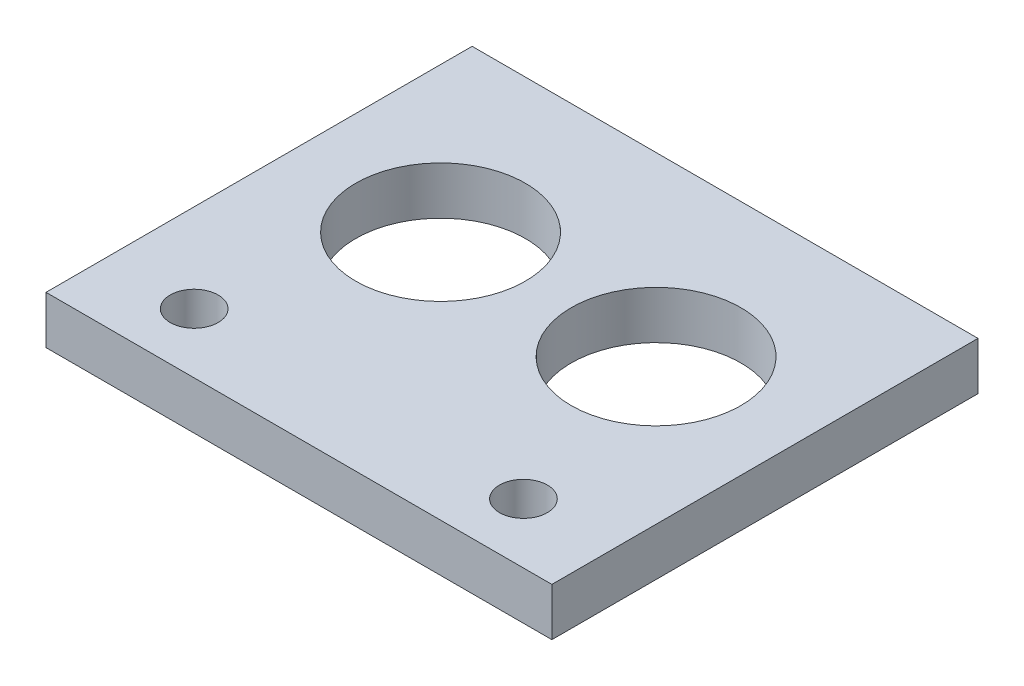
ISO-10303-21;
HEADER;
FILE_DESCRIPTION(('STEP AP214'),'2;1');
FILE_NAME('part.step','',(''),(''),'','','');
FILE_SCHEMA(('AUTOMOTIVE_DESIGN { 1 0 10303 214 1 1 1 1 }'));
ENDSEC;
DATA;
#1=APPLICATION_CONTEXT('core data for automotive mechanical design processes');
#2=APPLICATION_PROTOCOL_DEFINITION('international standard','automotive_design',2000,#1);
#3=PRODUCT_CONTEXT('',#1,'mechanical');
#4=PRODUCT('Part','Part','',(#3));
#5=PRODUCT_RELATED_PRODUCT_CATEGORY('part','',(#4));
#6=PRODUCT_DEFINITION_FORMATION('','',#4);
#7=PRODUCT_DEFINITION_CONTEXT('part definition',#1,'design');
#8=PRODUCT_DEFINITION('design','',#6,#7);
#9=PRODUCT_DEFINITION_SHAPE('','',#8);
#10=(LENGTH_UNIT() NAMED_UNIT(*) SI_UNIT(.MILLI.,.METRE.));
#11=(NAMED_UNIT(*) PLANE_ANGLE_UNIT() SI_UNIT($,.RADIAN.));
#12=(NAMED_UNIT(*) SI_UNIT($,.STERADIAN.) SOLID_ANGLE_UNIT());
#13=UNCERTAINTY_MEASURE_WITH_UNIT(LENGTH_MEASURE(1.E-05),#10,'distance_accuracy_value','');
#14=(GEOMETRIC_REPRESENTATION_CONTEXT(3) GLOBAL_UNCERTAINTY_ASSIGNED_CONTEXT((#13)) GLOBAL_UNIT_ASSIGNED_CONTEXT((#10,
#11,#12)) REPRESENTATION_CONTEXT('',''));
#15=CARTESIAN_POINT('',(0.,0.,0.));
#16=DIRECTION('',(0.,0.,1.));
#17=DIRECTION('',(1.,0.,0.));
#18=AXIS2_PLACEMENT_3D('',#15,#16,#17);
#19=CARTESIAN_POINT('',(0.,2.54,0.));
#20=DIRECTION('',(0.,1.,0.));
#21=DIRECTION('',(0.,0.,1.));
#22=AXIS2_PLACEMENT_3D('',#19,#20,#21);
#23=PLANE('',#22);
#24=CARTESIAN_POINT('',(2.18375,2.54,3.175));
#25=DIRECTION('',(0.,1.,0.));
#26=DIRECTION('',(0.,0.,1.));
#27=AXIS2_PLACEMENT_3D('',#24,#25,#26);
#28=CIRCLE('',#27,1.27);
#29=CARTESIAN_POINT('',(2.18375,2.54,4.445));
#30=VERTEX_POINT('',#29);
#31=EDGE_CURVE('E130',#30,#30,#28,.T.);
#32=ORIENTED_EDGE('',*,*,#31,.F.);
#33=EDGE_LOOP('',(#32));
#34=FACE_BOUND('',#33,.T.);
#35=CARTESIAN_POINT('',(5.2,2.54,-6.875));
#36=DIRECTION('',(0.,1.,0.));
#37=DIRECTION('',(0.,0.,1.));
#38=AXIS2_PLACEMENT_3D('',#35,#36,#37);
#39=CIRCLE('',#38,4.5);
#40=CARTESIAN_POINT('',(5.2,2.54,-2.375));
#41=VERTEX_POINT('',#40);
#42=EDGE_CURVE('E106',#41,#41,#39,.T.);
#43=ORIENTED_EDGE('',*,*,#42,.F.);
#44=EDGE_LOOP('',(#43));
#45=FACE_BOUND('',#44,.T.);
#46=DIRECTION('',(0.,0.,1.));
#47=VECTOR('',#46,1.);
#48=CARTESIAN_POINT('',(-2.5,2.54,-16.25));
#49=LINE('',#48,#47);
#50=CARTESIAN_POINT('',(-2.5,2.54,-16.25));
#51=VERTEX_POINT('',#50);
#52=CARTESIAN_POINT('',(-2.5,2.54,6.35));
#53=VERTEX_POINT('',#52);
#54=EDGE_CURVE('E93',#51,#53,#49,.T.);
#55=ORIENTED_EDGE('',*,*,#54,.T.);
#56=DIRECTION('',(1.,0.,0.));
#57=VECTOR('',#56,1.);
#58=CARTESIAN_POINT('',(-2.5,2.54,6.35));
#59=LINE('',#58,#57);
#60=CARTESIAN_POINT('',(24.33,2.54,6.35));
#61=VERTEX_POINT('',#60);
#62=EDGE_CURVE('E88',#53,#61,#59,.T.);
#63=ORIENTED_EDGE('',*,*,#62,.T.);
#64=DIRECTION('',(0.,0.,-1.));
#65=VECTOR('',#64,1.);
#66=CARTESIAN_POINT('',(24.33,2.54,-16.25));
#67=LINE('',#66,#65);
#68=CARTESIAN_POINT('',(24.33,2.54,-16.25));
#69=VERTEX_POINT('',#68);
#70=EDGE_CURVE('E90',#61,#69,#67,.T.);
#71=ORIENTED_EDGE('',*,*,#70,.T.);
#72=DIRECTION('',(-1.,0.,0.));
#73=VECTOR('',#72,1.);
#74=CARTESIAN_POINT('',(-2.5,2.54,-16.25));
#75=LINE('',#74,#73);
#76=EDGE_CURVE('E57',#69,#51,#75,.T.);
#77=ORIENTED_EDGE('',*,*,#76,.T.);
#78=EDGE_LOOP('',(#55,#63,#71,#77));
#79=FACE_BOUND('',#78,.T.);
#80=CARTESIAN_POINT('',(16.63,2.54,-6.875));
#81=DIRECTION('',(0.,1.,0.));
#82=DIRECTION('',(0.,0.,1.));
#83=AXIS2_PLACEMENT_3D('',#80,#81,#82);
#84=CIRCLE('',#83,4.5);
#85=CARTESIAN_POINT('',(16.63,2.54,-2.375));
#86=VERTEX_POINT('',#85);
#87=EDGE_CURVE('E123',#86,#86,#84,.T.);
#88=ORIENTED_EDGE('',*,*,#87,.F.);
#89=EDGE_LOOP('',(#88));
#90=FACE_BOUND('',#89,.T.);
#91=CARTESIAN_POINT('',(19.64625,2.54,3.175));
#92=DIRECTION('',(0.,1.,0.));
#93=DIRECTION('',(0.,0.,1.));
#94=AXIS2_PLACEMENT_3D('',#91,#92,#93);
#95=CIRCLE('',#94,1.27);
#96=CARTESIAN_POINT('',(19.64625,2.54,4.445));
#97=VERTEX_POINT('',#96);
#98=EDGE_CURVE('E134',#97,#97,#95,.T.);
#99=ORIENTED_EDGE('',*,*,#98,.F.);
#100=EDGE_LOOP('',(#99));
#101=FACE_BOUND('',#100,.T.);
#102=ADVANCED_FACE('F39',(#34,#45,#79,#90,#101),#23,.T.);
#103=CARTESIAN_POINT('',(0.,0.,0.));
#104=DIRECTION('',(0.,1.,0.));
#105=DIRECTION('',(0.,0.,1.));
#106=AXIS2_PLACEMENT_3D('',#103,#104,#105);
#107=PLANE('',#106);
#108=DIRECTION('',(0.,0.,1.));
#109=VECTOR('',#108,1.);
#110=CARTESIAN_POINT('',(-2.5,0.,-16.25));
#111=LINE('',#110,#109);
#112=CARTESIAN_POINT('',(-2.5,0.,-16.25));
#113=VERTEX_POINT('',#112);
#114=CARTESIAN_POINT('',(-2.5,0.,6.35));
#115=VERTEX_POINT('',#114);
#116=EDGE_CURVE('E103',#113,#115,#111,.T.);
#117=ORIENTED_EDGE('',*,*,#116,.F.);
#118=DIRECTION('',(-1.,0.,0.));
#119=VECTOR('',#118,1.);
#120=CARTESIAN_POINT('',(-2.5,0.,-16.25));
#121=LINE('',#120,#119);
#122=CARTESIAN_POINT('',(24.33,0.,-16.25));
#123=VERTEX_POINT('',#122);
#124=EDGE_CURVE('E76',#123,#113,#121,.T.);
#125=ORIENTED_EDGE('',*,*,#124,.F.);
#126=DIRECTION('',(0.,0.,-1.));
#127=VECTOR('',#126,1.);
#128=CARTESIAN_POINT('',(24.33,0.,-16.25));
#129=LINE('',#128,#127);
#130=CARTESIAN_POINT('',(24.33,0.,6.35));
#131=VERTEX_POINT('',#130);
#132=EDGE_CURVE('E71',#131,#123,#129,.T.);
#133=ORIENTED_EDGE('',*,*,#132,.F.);
#134=DIRECTION('',(1.,0.,0.));
#135=VECTOR('',#134,1.);
#136=CARTESIAN_POINT('',(-2.5,0.,6.35));
#137=LINE('',#136,#135);
#138=EDGE_CURVE('E92',#115,#131,#137,.T.);
#139=ORIENTED_EDGE('',*,*,#138,.F.);
#140=EDGE_LOOP('',(#117,#125,#133,#139));
#141=FACE_BOUND('',#140,.T.);
#142=CARTESIAN_POINT('',(5.2,0.,-6.875));
#143=DIRECTION('',(0.,1.,0.));
#144=DIRECTION('',(0.,0.,1.));
#145=AXIS2_PLACEMENT_3D('',#142,#143,#144);
#146=CIRCLE('',#145,4.5);
#147=CARTESIAN_POINT('',(5.2,0.,-2.375));
#148=VERTEX_POINT('',#147);
#149=EDGE_CURVE('E119',#148,#148,#146,.T.);
#150=ORIENTED_EDGE('',*,*,#149,.T.);
#151=EDGE_LOOP('',(#150));
#152=FACE_BOUND('',#151,.T.);
#153=CARTESIAN_POINT('',(16.63,0.,-6.875));
#154=DIRECTION('',(0.,1.,0.));
#155=DIRECTION('',(0.,0.,1.));
#156=AXIS2_PLACEMENT_3D('',#153,#154,#155);
#157=CIRCLE('',#156,4.5);
#158=CARTESIAN_POINT('',(16.63,0.,-2.375));
#159=VERTEX_POINT('',#158);
#160=EDGE_CURVE('E124',#159,#159,#157,.T.);
#161=ORIENTED_EDGE('',*,*,#160,.T.);
#162=EDGE_LOOP('',(#161));
#163=FACE_BOUND('',#162,.T.);
#164=CARTESIAN_POINT('',(2.18375,0.,3.175));
#165=DIRECTION('',(0.,1.,0.));
#166=DIRECTION('',(0.,0.,1.));
#167=AXIS2_PLACEMENT_3D('',#164,#165,#166);
#168=CIRCLE('',#167,1.27);
#169=CARTESIAN_POINT('',(2.18375,0.,4.445));
#170=VERTEX_POINT('',#169);
#171=EDGE_CURVE('E128',#170,#170,#168,.T.);
#172=ORIENTED_EDGE('',*,*,#171,.T.);
#173=EDGE_LOOP('',(#172));
#174=FACE_BOUND('',#173,.T.);
#175=CARTESIAN_POINT('',(19.64625,0.,3.175));
#176=DIRECTION('',(0.,1.,0.));
#177=DIRECTION('',(0.,0.,1.));
#178=AXIS2_PLACEMENT_3D('',#175,#176,#177);
#179=CIRCLE('',#178,1.27);
#180=CARTESIAN_POINT('',(19.64625,0.,4.445));
#181=VERTEX_POINT('',#180);
#182=EDGE_CURVE('E138',#181,#181,#179,.T.);
#183=ORIENTED_EDGE('',*,*,#182,.T.);
#184=EDGE_LOOP('',(#183));
#185=FACE_BOUND('',#184,.T.);
#186=ADVANCED_FACE('F111',(#141,#152,#163,#174,#185),#107,.F.);
#187=CARTESIAN_POINT('',(-2.5,2.54,-16.25));
#188=DIRECTION('',(1.,0.,0.));
#189=DIRECTION('',(0.,0.,-1.));
#190=AXIS2_PLACEMENT_3D('',#187,#188,#189);
#191=PLANE('',#190);
#192=ORIENTED_EDGE('',*,*,#116,.T.);
#193=DIRECTION('',(0.,-1.,0.));
#194=VECTOR('',#193,1.);
#195=CARTESIAN_POINT('',(-2.5,2.54,6.35));
#196=LINE('',#195,#194);
#197=EDGE_CURVE('E11',#53,#115,#196,.T.);
#198=ORIENTED_EDGE('',*,*,#197,.F.);
#199=ORIENTED_EDGE('',*,*,#54,.F.);
#200=DIRECTION('',(0.,-1.,0.));
#201=VECTOR('',#200,1.);
#202=CARTESIAN_POINT('',(-2.5,2.54,-16.25));
#203=LINE('',#202,#201);
#204=EDGE_CURVE('E97',#51,#113,#203,.T.);
#205=ORIENTED_EDGE('',*,*,#204,.T.);
#206=EDGE_LOOP('',(#192,#198,#199,#205));
#207=FACE_BOUND('',#206,.T.);
#208=ADVANCED_FACE('F41',(#207),#191,.F.);
#209=CARTESIAN_POINT('',(-2.5,2.54,6.35));
#210=DIRECTION('',(0.,0.,-1.));
#211=DIRECTION('',(-1.,0.,0.));
#212=AXIS2_PLACEMENT_3D('',#209,#210,#211);
#213=PLANE('',#212);
#214=ORIENTED_EDGE('',*,*,#138,.T.);
#215=DIRECTION('',(0.,-1.,0.));
#216=VECTOR('',#215,1.);
#217=CARTESIAN_POINT('',(24.33,2.54,6.35));
#218=LINE('',#217,#216);
#219=EDGE_CURVE('E48',#61,#131,#218,.T.);
#220=ORIENTED_EDGE('',*,*,#219,.F.);
#221=ORIENTED_EDGE('',*,*,#62,.F.);
#222=ORIENTED_EDGE('',*,*,#197,.T.);
#223=EDGE_LOOP('',(#214,#220,#221,#222));
#224=FACE_BOUND('',#223,.T.);
#225=ADVANCED_FACE('F94',(#224),#213,.F.);
#226=CARTESIAN_POINT('',(24.33,2.54,-16.25));
#227=DIRECTION('',(-1.,0.,0.));
#228=DIRECTION('',(0.,0.,1.));
#229=AXIS2_PLACEMENT_3D('',#226,#227,#228);
#230=PLANE('',#229);
#231=ORIENTED_EDGE('',*,*,#132,.T.);
#232=DIRECTION('',(0.,-1.,0.));
#233=VECTOR('',#232,1.);
#234=CARTESIAN_POINT('',(24.33,2.54,-16.25));
#235=LINE('',#234,#233);
#236=EDGE_CURVE('E96',#69,#123,#235,.T.);
#237=ORIENTED_EDGE('',*,*,#236,.F.);
#238=ORIENTED_EDGE('',*,*,#70,.F.);
#239=ORIENTED_EDGE('',*,*,#219,.T.);
#240=EDGE_LOOP('',(#231,#237,#238,#239));
#241=FACE_BOUND('',#240,.T.);
#242=ADVANCED_FACE('F100',(#241),#230,.F.);
#243=CARTESIAN_POINT('',(-2.5,2.54,-16.25));
#244=DIRECTION('',(0.,0.,1.));
#245=DIRECTION('',(1.,0.,0.));
#246=AXIS2_PLACEMENT_3D('',#243,#244,#245);
#247=PLANE('',#246);
#248=ORIENTED_EDGE('',*,*,#124,.T.);
#249=ORIENTED_EDGE('',*,*,#204,.F.);
#250=ORIENTED_EDGE('',*,*,#76,.F.);
#251=ORIENTED_EDGE('',*,*,#236,.T.);
#252=EDGE_LOOP('',(#248,#249,#250,#251));
#253=FACE_BOUND('',#252,.T.);
#254=ADVANCED_FACE('F112',(#253),#247,.F.);
#255=CARTESIAN_POINT('',(5.2,2.54,-6.875));
#256=DIRECTION('',(0.,-1.,0.));
#257=DIRECTION('',(0.,0.,-1.));
#258=AXIS2_PLACEMENT_3D('',#255,#256,#257);
#259=CYLINDRICAL_SURFACE('',#258,4.5);
#260=ORIENTED_EDGE('',*,*,#42,.T.);
#261=EDGE_LOOP('',(#260));
#262=FACE_BOUND('',#261,.T.);
#263=ORIENTED_EDGE('',*,*,#149,.F.);
#264=EDGE_LOOP('',(#263));
#265=FACE_BOUND('',#264,.T.);
#266=ADVANCED_FACE('F154',(#262,#265),#259,.F.);
#267=CARTESIAN_POINT('',(16.63,2.54,-6.875));
#268=DIRECTION('',(0.,-1.,0.));
#269=DIRECTION('',(0.,0.,-1.));
#270=AXIS2_PLACEMENT_3D('',#267,#268,#269);
#271=CYLINDRICAL_SURFACE('',#270,4.5);
#272=ORIENTED_EDGE('',*,*,#87,.T.);
#273=EDGE_LOOP('',(#272));
#274=FACE_BOUND('',#273,.T.);
#275=ORIENTED_EDGE('',*,*,#160,.F.);
#276=EDGE_LOOP('',(#275));
#277=FACE_BOUND('',#276,.T.);
#278=ADVANCED_FACE('F199',(#274,#277),#271,.F.);
#279=CARTESIAN_POINT('',(2.18375,2.54,3.175));
#280=DIRECTION('',(0.,-1.,0.));
#281=DIRECTION('',(0.,0.,-1.));
#282=AXIS2_PLACEMENT_3D('',#279,#280,#281);
#283=CYLINDRICAL_SURFACE('',#282,1.27);
#284=ORIENTED_EDGE('',*,*,#31,.T.);
#285=EDGE_LOOP('',(#284));
#286=FACE_BOUND('',#285,.T.);
#287=ORIENTED_EDGE('',*,*,#171,.F.);
#288=EDGE_LOOP('',(#287));
#289=FACE_BOUND('',#288,.T.);
#290=ADVANCED_FACE('F208',(#286,#289),#283,.F.);
#291=CARTESIAN_POINT('',(19.64625,2.54,3.175));
#292=DIRECTION('',(0.,-1.,0.));
#293=DIRECTION('',(0.,0.,-1.));
#294=AXIS2_PLACEMENT_3D('',#291,#292,#293);
#295=CYLINDRICAL_SURFACE('',#294,1.27);
#296=ORIENTED_EDGE('',*,*,#98,.T.);
#297=EDGE_LOOP('',(#296));
#298=FACE_BOUND('',#297,.T.);
#299=ORIENTED_EDGE('',*,*,#182,.F.);
#300=EDGE_LOOP('',(#299));
#301=FACE_BOUND('',#300,.T.);
#302=ADVANCED_FACE('F142',(#298,#301),#295,.F.);
#303=CLOSED_SHELL('',(#102,#186,#208,#225,#242,#254,#266,#278,#290,#302));
#304=MANIFOLD_SOLID_BREP('B2',#303);
#305=ADVANCED_BREP_SHAPE_REPRESENTATION('',(#18,#304),#14);
#306=SHAPE_DEFINITION_REPRESENTATION(#9,#305);
ENDSEC;
END-ISO-10303-21;
